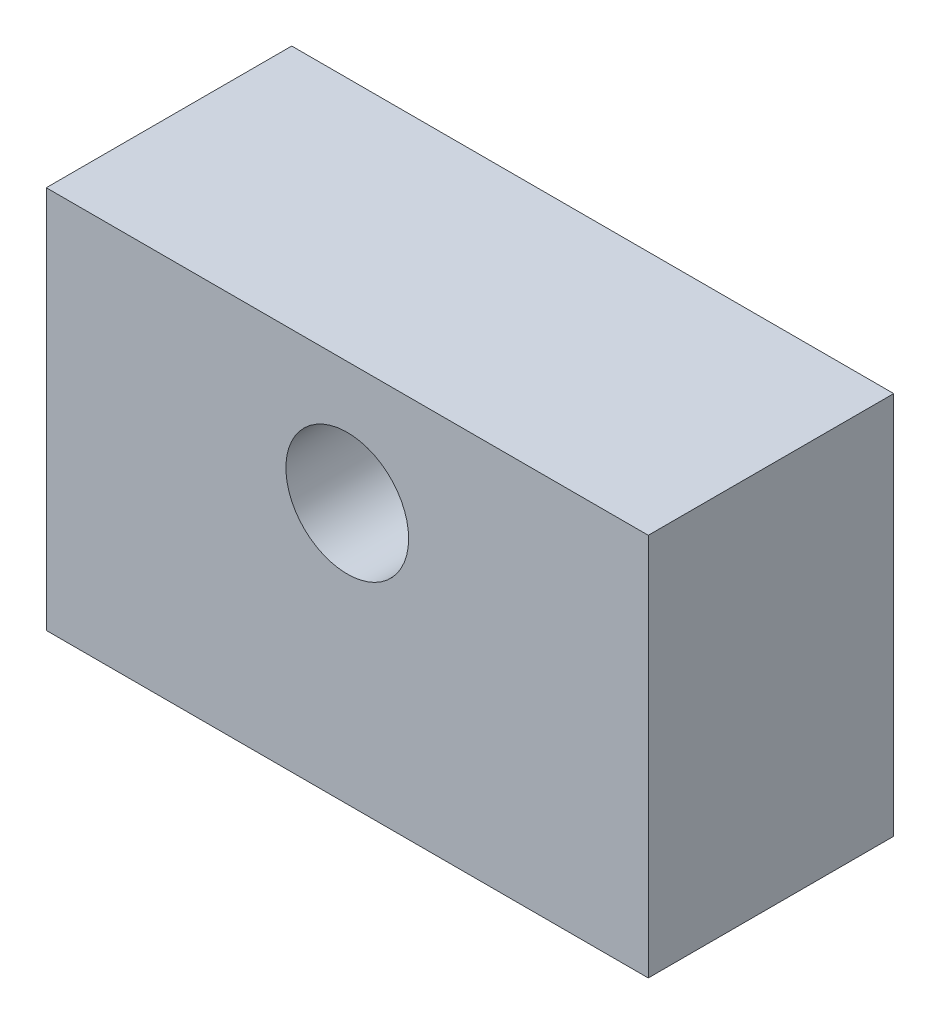
ISO-10303-21;
HEADER;
FILE_DESCRIPTION(('STEP AP214'),'2;1');
FILE_NAME('part.step','',(''),(''),'','','');
FILE_SCHEMA(('AUTOMOTIVE_DESIGN { 1 0 10303 214 1 1 1 1 }'));
ENDSEC;
DATA;
#1=APPLICATION_CONTEXT('core data for automotive mechanical design processes');
#2=APPLICATION_PROTOCOL_DEFINITION('international standard','automotive_design',2000,#1);
#3=PRODUCT_CONTEXT('',#1,'mechanical');
#4=PRODUCT('Part','Part','',(#3));
#5=PRODUCT_RELATED_PRODUCT_CATEGORY('part','',(#4));
#6=PRODUCT_DEFINITION_FORMATION('','',#4);
#7=PRODUCT_DEFINITION_CONTEXT('part definition',#1,'design');
#8=PRODUCT_DEFINITION('design','',#6,#7);
#9=PRODUCT_DEFINITION_SHAPE('','',#8);
#10=(LENGTH_UNIT() NAMED_UNIT(*) SI_UNIT(.MILLI.,.METRE.));
#11=(NAMED_UNIT(*) PLANE_ANGLE_UNIT() SI_UNIT($,.RADIAN.));
#12=(NAMED_UNIT(*) SI_UNIT($,.STERADIAN.) SOLID_ANGLE_UNIT());
#13=UNCERTAINTY_MEASURE_WITH_UNIT(LENGTH_MEASURE(1.E-05),#10,'distance_accuracy_value','');
#14=(GEOMETRIC_REPRESENTATION_CONTEXT(3) GLOBAL_UNCERTAINTY_ASSIGNED_CONTEXT((#13)) GLOBAL_UNIT_ASSIGNED_CONTEXT((#10,
#11,#12)) REPRESENTATION_CONTEXT('',''));
#15=CARTESIAN_POINT('',(0.,0.,0.));
#16=DIRECTION('',(0.,0.,1.));
#17=DIRECTION('',(1.,0.,0.));
#18=AXIS2_PLACEMENT_3D('',#15,#16,#17);
#19=CARTESIAN_POINT('',(0.,-19.8376419710467,6.35));
#20=DIRECTION('',(0.,1.,0.));
#21=DIRECTION('',(-1.,0.,0.));
#22=AXIS2_PLACEMENT_3D('',#19,#20,#21);
#23=PLANE('',#22);
#24=CARTESIAN_POINT('',(23.3612811681514,-19.8376419710467,0.));
#25=DIRECTION('',(0.,1.,0.));
#26=DIRECTION('',(-1.,0.,0.));
#27=AXIS2_PLACEMENT_3D('',#24,#25,#26);
#28=ELLIPSE('',#27,3.66617420935412,3.175);
#29=CARTESIAN_POINT('',(19.6951069587973,-19.8376419710467,0.));
#30=VERTEX_POINT('',#29);
#31=EDGE_CURVE('E11',#30,#30,#28,.T.);
#32=ORIENTED_EDGE('',*,*,#31,.T.);
#33=EDGE_LOOP('',(#32));
#34=FACE_BOUND('',#33,.T.);
#35=DIRECTION('',(1.,0.,0.));
#36=VECTOR('',#35,1.);
#37=CARTESIAN_POINT('',(0.,-19.8376419710467,-6.35));
#38=LINE('',#37,#36);
#39=CARTESIAN_POINT('',(0.,-19.8376419710467,-6.35));
#40=VERTEX_POINT('',#39);
#41=CARTESIAN_POINT('',(31.1483748908686,-19.8376419710467,-6.35));
#42=VERTEX_POINT('',#41);
#43=EDGE_CURVE('E94',#40,#42,#38,.T.);
#44=ORIENTED_EDGE('',*,*,#43,.T.);
#45=DIRECTION('',(0.,0.,-1.));
#46=VECTOR('',#45,1.);
#47=CARTESIAN_POINT('',(31.1483748908686,-19.8376419710467,6.35));
#48=LINE('',#47,#46);
#49=CARTESIAN_POINT('',(31.1483748908686,-19.8376419710467,6.35));
#50=VERTEX_POINT('',#49);
#51=EDGE_CURVE('E92',#50,#42,#48,.T.);
#52=ORIENTED_EDGE('',*,*,#51,.F.);
#53=DIRECTION('',(1.,0.,0.));
#54=VECTOR('',#53,1.);
#55=CARTESIAN_POINT('',(0.,-19.8376419710467,6.35));
#56=LINE('',#55,#54);
#57=CARTESIAN_POINT('',(0.,-19.8376419710467,6.35));
#58=VERTEX_POINT('',#57);
#59=EDGE_CURVE('E84',#58,#50,#56,.T.);
#60=ORIENTED_EDGE('',*,*,#59,.F.);
#61=DIRECTION('',(0.,0.,-1.));
#62=VECTOR('',#61,1.);
#63=CARTESIAN_POINT('',(0.,-19.8376419710467,6.35));
#64=LINE('',#63,#62);
#65=EDGE_CURVE('E95',#58,#40,#64,.T.);
#66=ORIENTED_EDGE('',*,*,#65,.T.);
#67=EDGE_LOOP('',(#44,#52,#60,#66));
#68=FACE_BOUND('',#67,.T.);
#69=CARTESIAN_POINT('',(7.78709372271712,-19.8376419710467,0.));
#70=DIRECTION('',(0.,1.,0.));
#71=DIRECTION('',(1.,0.,0.));
#72=AXIS2_PLACEMENT_3D('',#69,#70,#71);
#73=ELLIPSE('',#72,3.66617420935413,3.175);
#74=CARTESIAN_POINT('',(11.4532679320712,-19.8376419710467,0.));
#75=VERTEX_POINT('',#74);
#76=EDGE_CURVE('E45',#75,#75,#73,.F.);
#77=ORIENTED_EDGE('',*,*,#76,.F.);
#78=EDGE_LOOP('',(#77));
#79=FACE_BOUND('',#78,.T.);
#80=ADVANCED_FACE('F36',(#34,#68,#79),#23,.F.);
#81=CARTESIAN_POINT('',(0.,0.,6.35));
#82=DIRECTION('',(1.,0.,0.));
#83=DIRECTION('',(0.,1.,0.));
#84=AXIS2_PLACEMENT_3D('',#81,#82,#83);
#85=PLANE('',#84);
#86=CARTESIAN_POINT('',(0.,-6.35,0.));
#87=DIRECTION('',(-1.,0.,0.));
#88=DIRECTION('',(0.,-1.,0.));
#89=AXIS2_PLACEMENT_3D('',#86,#87,#88);
#90=CIRCLE('',#89,3.175);
#91=CARTESIAN_POINT('',(0.,-9.525,0.));
#92=VERTEX_POINT('',#91);
#93=EDGE_CURVE('E182',#92,#92,#90,.T.);
#94=ORIENTED_EDGE('',*,*,#93,.F.);
#95=EDGE_LOOP('',(#94));
#96=FACE_BOUND('',#95,.T.);
#97=DIRECTION('',(0.,-1.,0.));
#98=VECTOR('',#97,1.);
#99=CARTESIAN_POINT('',(0.,0.,-6.35));
#100=LINE('',#99,#98);
#101=CARTESIAN_POINT('',(0.,0.,-6.35));
#102=VERTEX_POINT('',#101);
#103=EDGE_CURVE('E104',#102,#40,#100,.T.);
#104=ORIENTED_EDGE('',*,*,#103,.T.);
#105=ORIENTED_EDGE('',*,*,#65,.F.);
#106=DIRECTION('',(0.,-1.,0.));
#107=VECTOR('',#106,1.);
#108=CARTESIAN_POINT('',(0.,0.,6.35));
#109=LINE('',#108,#107);
#110=CARTESIAN_POINT('',(0.,0.,6.35));
#111=VERTEX_POINT('',#110);
#112=EDGE_CURVE('E89',#111,#58,#109,.T.);
#113=ORIENTED_EDGE('',*,*,#112,.F.);
#114=DIRECTION('',(0.,0.,-1.));
#115=VECTOR('',#114,1.);
#116=CARTESIAN_POINT('',(0.,0.,6.35));
#117=LINE('',#116,#115);
#118=EDGE_CURVE('E100',#111,#102,#117,.T.);
#119=ORIENTED_EDGE('',*,*,#118,.T.);
#120=EDGE_LOOP('',(#104,#105,#113,#119));
#121=FACE_BOUND('',#120,.T.);
#122=ADVANCED_FACE('F38',(#96,#121),#85,.F.);
#123=CARTESIAN_POINT('',(31.1483748908686,0.,6.35));
#124=DIRECTION('',(-1.,0.,0.));
#125=DIRECTION('',(0.,-1.,0.));
#126=AXIS2_PLACEMENT_3D('',#123,#124,#125);
#127=PLANE('',#126);
#128=DIRECTION('',(0.,1.,0.));
#129=VECTOR('',#128,1.);
#130=CARTESIAN_POINT('',(31.1483748908686,0.,-6.35));
#131=LINE('',#130,#129);
#132=CARTESIAN_POINT('',(31.1483748908686,0.,-6.35));
#133=VERTEX_POINT('',#132);
#134=EDGE_CURVE('E70',#42,#133,#131,.T.);
#135=ORIENTED_EDGE('',*,*,#134,.T.);
#136=DIRECTION('',(0.,0.,-1.));
#137=VECTOR('',#136,1.);
#138=CARTESIAN_POINT('',(31.1483748908686,0.,6.35));
#139=LINE('',#138,#137);
#140=CARTESIAN_POINT('',(31.1483748908686,0.,6.35));
#141=VERTEX_POINT('',#140);
#142=EDGE_CURVE('E96',#141,#133,#139,.T.);
#143=ORIENTED_EDGE('',*,*,#142,.F.);
#144=DIRECTION('',(0.,1.,0.));
#145=VECTOR('',#144,1.);
#146=CARTESIAN_POINT('',(31.1483748908686,0.,6.35));
#147=LINE('',#146,#145);
#148=EDGE_CURVE('E87',#50,#141,#147,.T.);
#149=ORIENTED_EDGE('',*,*,#148,.F.);
#150=ORIENTED_EDGE('',*,*,#51,.T.);
#151=EDGE_LOOP('',(#135,#143,#149,#150));
#152=FACE_BOUND('',#151,.T.);
#153=ADVANCED_FACE('F98',(#152),#127,.F.);
#154=CARTESIAN_POINT('',(0.,0.,6.35));
#155=DIRECTION('',(0.,-1.,0.));
#156=DIRECTION('',(1.,0.,0.));
#157=AXIS2_PLACEMENT_3D('',#154,#155,#156);
#158=PLANE('',#157);
#159=DIRECTION('',(-1.,0.,0.));
#160=VECTOR('',#159,1.);
#161=CARTESIAN_POINT('',(0.,0.,-6.35));
#162=LINE('',#161,#160);
#163=EDGE_CURVE('E76',#133,#102,#162,.T.);
#164=ORIENTED_EDGE('',*,*,#163,.T.);
#165=ORIENTED_EDGE('',*,*,#118,.F.);
#166=DIRECTION('',(-1.,0.,0.));
#167=VECTOR('',#166,1.);
#168=CARTESIAN_POINT('',(0.,0.,6.35));
#169=LINE('',#168,#167);
#170=EDGE_CURVE('E53',#141,#111,#169,.T.);
#171=ORIENTED_EDGE('',*,*,#170,.F.);
#172=ORIENTED_EDGE('',*,*,#142,.T.);
#173=EDGE_LOOP('',(#164,#165,#171,#172));
#174=FACE_BOUND('',#173,.T.);
#175=ADVANCED_FACE('F126',(#174),#158,.F.);
#176=CARTESIAN_POINT('',(0.,0.,6.35));
#177=DIRECTION('',(0.,0.,1.));
#178=DIRECTION('',(1.,0.,0.));
#179=AXIS2_PLACEMENT_3D('',#176,#177,#178);
#180=PLANE('',#179);
#181=CARTESIAN_POINT('',(15.5741874454343,-6.35,6.35));
#182=DIRECTION('',(0.,0.,-1.));
#183=DIRECTION('',(-1.,0.,0.));
#184=AXIS2_PLACEMENT_3D('',#181,#182,#183);
#185=CIRCLE('',#184,3.175);
#186=CARTESIAN_POINT('',(18.7491874454343,-6.35,6.35));
#187=VERTEX_POINT('',#186);
#188=EDGE_CURVE('E171',#187,#187,#185,.T.);
#189=ORIENTED_EDGE('',*,*,#188,.T.);
#190=EDGE_LOOP('',(#189));
#191=FACE_BOUND('',#190,.T.);
#192=ORIENTED_EDGE('',*,*,#112,.T.);
#193=ORIENTED_EDGE('',*,*,#59,.T.);
#194=ORIENTED_EDGE('',*,*,#148,.T.);
#195=ORIENTED_EDGE('',*,*,#170,.T.);
#196=EDGE_LOOP('',(#192,#193,#194,#195));
#197=FACE_BOUND('',#196,.T.);
#198=ADVANCED_FACE('F85',(#191,#197),#180,.T.);
#199=CARTESIAN_POINT('',(0.,0.,-6.35));
#200=DIRECTION('',(0.,0.,1.));
#201=DIRECTION('',(1.,0.,0.));
#202=AXIS2_PLACEMENT_3D('',#199,#200,#201);
#203=PLANE('',#202);
#204=ORIENTED_EDGE('',*,*,#103,.F.);
#205=ORIENTED_EDGE('',*,*,#163,.F.);
#206=ORIENTED_EDGE('',*,*,#134,.F.);
#207=ORIENTED_EDGE('',*,*,#43,.F.);
#208=EDGE_LOOP('',(#204,#205,#206,#207));
#209=FACE_BOUND('',#208,.T.);
#210=ADVANCED_FACE('F129',(#209),#203,.F.);
#211=CARTESIAN_POINT('',(9.525,-6.35,0.));
#212=DIRECTION('',(-1.,0.,0.));
#213=DIRECTION('',(0.,-1.,0.));
#214=AXIS2_PLACEMENT_3D('',#211,#212,#213);
#215=CYLINDRICAL_SURFACE('',#214,3.175);
#216=CARTESIAN_POINT('',(9.525,-6.35,0.));
#217=DIRECTION('',(-1.,0.,0.));
#218=DIRECTION('',(0.,-1.,0.));
#219=AXIS2_PLACEMENT_3D('',#216,#217,#218);
#220=CIRCLE('',#219,3.175);
#221=CARTESIAN_POINT('',(9.525,-9.525,0.));
#222=VERTEX_POINT('',#221);
#223=EDGE_CURVE('E107',#222,#222,#220,.T.);
#224=CARTESIAN_POINT('',(9.525,-9.525,0.));
#225=CARTESIAN_POINT('',(9.42578125,-9.525,0.));
#226=CARTESIAN_POINT('',(9.3265625,-9.525,0.));
#227=CARTESIAN_POINT('',(9.128125,-9.525,0.));
#228=CARTESIAN_POINT('',(9.02890625,-9.525,0.));
#229=CARTESIAN_POINT('',(8.83046875,-9.525,0.));
#230=CARTESIAN_POINT('',(8.73125,-9.525,0.));
#231=CARTESIAN_POINT('',(8.5328125,-9.525,0.));
#232=CARTESIAN_POINT('',(8.43359375,-9.525,0.));
#233=CARTESIAN_POINT('',(8.23515625,-9.525,0.));
#234=CARTESIAN_POINT('',(8.1359375,-9.525,0.));
#235=CARTESIAN_POINT('',(7.9375,-9.525,0.));
#236=CARTESIAN_POINT('',(7.83828125,-9.525,0.));
#237=CARTESIAN_POINT('',(7.63984375,-9.525,0.));
#238=CARTESIAN_POINT('',(7.540625,-9.525,0.));
#239=CARTESIAN_POINT('',(7.3421875,-9.525,0.));
#240=CARTESIAN_POINT('',(7.24296875,-9.525,0.));
#241=CARTESIAN_POINT('',(7.04453125,-9.525,0.));
#242=CARTESIAN_POINT('',(6.9453125,-9.525,0.));
#243=CARTESIAN_POINT('',(6.746875,-9.525,0.));
#244=CARTESIAN_POINT('',(6.64765625,-9.525,0.));
#245=CARTESIAN_POINT('',(6.44921875,-9.525,0.));
#246=CARTESIAN_POINT('',(6.35,-9.525,0.));
#247=CARTESIAN_POINT('',(6.1515625,-9.525,0.));
#248=CARTESIAN_POINT('',(6.05234375,-9.525,0.));
#249=CARTESIAN_POINT('',(5.85390625,-9.525,0.));
#250=CARTESIAN_POINT('',(5.7546875,-9.525,0.));
#251=CARTESIAN_POINT('',(5.55625,-9.525,0.));
#252=CARTESIAN_POINT('',(5.45703125,-9.525,0.));
#253=CARTESIAN_POINT('',(5.25859375,-9.525,0.));
#254=CARTESIAN_POINT('',(5.159375,-9.525,0.));
#255=CARTESIAN_POINT('',(4.9609375,-9.525,0.));
#256=CARTESIAN_POINT('',(4.86171875,-9.525,0.));
#257=CARTESIAN_POINT('',(4.66328125,-9.525,0.));
#258=CARTESIAN_POINT('',(4.5640625,-9.525,0.));
#259=CARTESIAN_POINT('',(4.365625,-9.525,0.));
#260=CARTESIAN_POINT('',(4.26640625,-9.525,0.));
#261=CARTESIAN_POINT('',(4.06796875,-9.525,0.));
#262=CARTESIAN_POINT('',(3.96875,-9.525,0.));
#263=CARTESIAN_POINT('',(3.7703125,-9.525,0.));
#264=CARTESIAN_POINT('',(3.67109375,-9.525,0.));
#265=CARTESIAN_POINT('',(3.47265625,-9.525,0.));
#266=CARTESIAN_POINT('',(3.3734375,-9.525,0.));
#267=CARTESIAN_POINT('',(3.175,-9.525,0.));
#268=CARTESIAN_POINT('',(3.07578125,-9.525,0.));
#269=CARTESIAN_POINT('',(2.87734375,-9.525,0.));
#270=CARTESIAN_POINT('',(2.778125,-9.525,0.));
#271=CARTESIAN_POINT('',(2.5796875,-9.525,0.));
#272=CARTESIAN_POINT('',(2.48046875,-9.525,0.));
#273=CARTESIAN_POINT('',(2.28203125,-9.525,0.));
#274=CARTESIAN_POINT('',(2.1828125,-9.525,0.));
#275=CARTESIAN_POINT('',(1.984375,-9.525,0.));
#276=CARTESIAN_POINT('',(1.88515625,-9.525,0.));
#277=CARTESIAN_POINT('',(1.68671875,-9.525,0.));
#278=CARTESIAN_POINT('',(1.5875,-9.525,0.));
#279=CARTESIAN_POINT('',(1.3890625,-9.525,0.));
#280=CARTESIAN_POINT('',(1.28984375,-9.525,0.));
#281=CARTESIAN_POINT('',(1.09140625,-9.525,0.));
#282=CARTESIAN_POINT('',(0.992187500000001,-9.525,0.));
#283=CARTESIAN_POINT('',(0.793750000000001,-9.525,0.));
#284=CARTESIAN_POINT('',(0.69453125,-9.525,0.));
#285=CARTESIAN_POINT('',(0.49609375,-9.525,0.));
#286=CARTESIAN_POINT('',(0.396875,-9.525,0.));
#287=CARTESIAN_POINT('',(0.1984375,-9.525,0.));
#288=CARTESIAN_POINT('',(0.0992187500000001,-9.525,0.));
#289=CARTESIAN_POINT('',(0.,-9.525,0.));
#290=B_SPLINE_CURVE_WITH_KNOTS('',3,(#224,#225,#226,#227,#228,#229,#230,#231,#232,#233,#234,
#235,#236,#237,#238,#239,#240,#241,#242,#243,#244,#245,#246,#247,#248,#249,#250,#251,#252,#253,
#254,#255,#256,#257,#258,#259,#260,#261,#262,#263,#264,#265,#266,#267,#268,#269,#270,#271,#272,
#273,#274,#275,#276,#277,#278,#279,#280,#281,#282,#283,#284,#285,#286,#287,#288,#289),
.UNSPECIFIED.,.F.,.F.,(4,2,2,2,2,2,2,2,2,2,2,2,2,2,2,2,2,2,2,2,2,2,2,2,2,2,2,2,2,2,2,2,4),(0.,
0.297656249999998,0.595312499999999,0.892968749999999,1.190625,1.48828125,1.7859375,2.08359375,
2.38125,2.67890625,2.9765625,3.27421875,3.571875,3.86953125,4.1671875,4.46484375,4.7625,
5.06015625,5.3578125,5.65546875,5.953125,6.25078125,6.5484375,6.84609375,7.14375,7.44140625,
7.7390625,8.03671875,8.334375,8.63203125,8.9296875,9.22734375,9.525),.UNSPECIFIED.);
#291=EDGE_CURVE('BSEAM132',#222,#92,#290,.T.);
#292=ORIENTED_EDGE('',*,*,#223,.F.);
#293=ORIENTED_EDGE('',*,*,#93,.T.);
#294=ORIENTED_EDGE('',*,*,#291,.T.);
#295=ORIENTED_EDGE('',*,*,#291,.F.);
#296=EDGE_LOOP('',(#292,#294,#293,#295));
#297=FACE_BOUND('',#296,.T.);
#298=ADVANCED_FACE('F132',(#297),#215,.F.);
#299=CARTESIAN_POINT('',(9.525,-6.35,0.));
#300=DIRECTION('',(-1.,0.,0.));
#301=DIRECTION('',(0.,-1.,0.));
#302=AXIS2_PLACEMENT_3D('',#299,#300,#301);
#303=PLANE('',#302);
#304=ORIENTED_EDGE('',*,*,#223,.T.);
#305=EDGE_LOOP('',(#304));
#306=FACE_BOUND('',#305,.T.);
#307=ADVANCED_FACE('F139',(#306),#303,.T.);
#308=CARTESIAN_POINT('',(5.83963727933594,-23.2107354765103,0.));
#309=DIRECTION('',(0.500000000000001,0.866025403784438,0.));
#310=DIRECTION('',(-0.866025403784438,0.500000000000001,0.));
#311=AXIS2_PLACEMENT_3D('',#308,#309,#310);
#312=CYLINDRICAL_SURFACE('',#311,3.175);
#313=CARTESIAN_POINT('',(12.5495937227171,-11.58875,0.));
#314=DIRECTION('',(-0.500000000000001,-0.866025403784438,0.));
#315=DIRECTION('',(0.866025403784438,-0.500000000000001,0.));
#316=AXIS2_PLACEMENT_3D('',#313,#314,#315);
#317=CIRCLE('',#316,3.175);
#318=CARTESIAN_POINT('',(15.2992243797327,-13.17625,0.));
#319=VERTEX_POINT('',#318);
#320=EDGE_CURVE('E178',#319,#319,#317,.T.);
#321=ORIENTED_EDGE('',*,*,#320,.F.);
#322=EDGE_LOOP('',(#321));
#323=FACE_BOUND('',#322,.T.);
#324=ORIENTED_EDGE('',*,*,#76,.T.);
#325=EDGE_LOOP('',(#324));
#326=FACE_BOUND('',#325,.T.);
#327=ADVANCED_FACE('F116',(#323,#326),#312,.F.);
#328=CARTESIAN_POINT('',(12.5495937227171,-11.58875,0.));
#329=DIRECTION('',(-0.500000000000001,-0.866025403784438,0.));
#330=DIRECTION('',(0.866025403784438,-0.500000000000001,0.));
#331=AXIS2_PLACEMENT_3D('',#328,#329,#330);
#332=PLANE('',#331);
#333=ORIENTED_EDGE('',*,*,#320,.T.);
#334=EDGE_LOOP('',(#333));
#335=FACE_BOUND('',#334,.T.);
#336=ADVANCED_FACE('F146',(#335),#332,.T.);
#337=CARTESIAN_POINT('',(15.5741874454343,-6.35,-3.175));
#338=DIRECTION('',(0.,0.,1.));
#339=DIRECTION('',(1.,0.,0.));
#340=AXIS2_PLACEMENT_3D('',#337,#338,#339);
#341=CYLINDRICAL_SURFACE('',#340,3.175);
#342=CARTESIAN_POINT('',(15.5741874454343,-6.35,-3.175));
#343=DIRECTION('',(0.,0.,-1.));
#344=DIRECTION('',(-1.,0.,0.));
#345=AXIS2_PLACEMENT_3D('',#342,#343,#344);
#346=CIRCLE('',#345,3.175);
#347=CARTESIAN_POINT('',(18.7491874454343,-6.35,-3.175));
#348=VERTEX_POINT('',#347);
#349=EDGE_CURVE('E174',#348,#348,#346,.T.);
#350=CARTESIAN_POINT('',(18.7491874454343,-6.35,-3.175));
#351=CARTESIAN_POINT('',(18.7491874454343,-6.35,-3.07578125));
#352=CARTESIAN_POINT('',(18.7491874454343,-6.35,-2.9765625));
#353=CARTESIAN_POINT('',(18.7491874454343,-6.35,-2.778125));
#354=CARTESIAN_POINT('',(18.7491874454343,-6.35,-2.67890625));
#355=CARTESIAN_POINT('',(18.7491874454343,-6.35,-2.48046875));
#356=CARTESIAN_POINT('',(18.7491874454343,-6.35,-2.38125));
#357=CARTESIAN_POINT('',(18.7491874454343,-6.35,-2.1828125));
#358=CARTESIAN_POINT('',(18.7491874454343,-6.35,-2.08359375));
#359=CARTESIAN_POINT('',(18.7491874454343,-6.35,-1.88515625));
#360=CARTESIAN_POINT('',(18.7491874454343,-6.35,-1.7859375));
#361=CARTESIAN_POINT('',(18.7491874454343,-6.35,-1.5875));
#362=CARTESIAN_POINT('',(18.7491874454343,-6.35,-1.48828125));
#363=CARTESIAN_POINT('',(18.7491874454343,-6.35,-1.28984375));
#364=CARTESIAN_POINT('',(18.7491874454343,-6.35,-1.190625));
#365=CARTESIAN_POINT('',(18.7491874454343,-6.35,-0.992187500000001));
#366=CARTESIAN_POINT('',(18.7491874454343,-6.35,-0.892968750000001));
#367=CARTESIAN_POINT('',(18.7491874454343,-6.35,-0.694531250000001));
#368=CARTESIAN_POINT('',(18.7491874454343,-6.35,-0.5953125));
#369=CARTESIAN_POINT('',(18.7491874454343,-6.35,-0.396875));
#370=CARTESIAN_POINT('',(18.7491874454343,-6.35,-0.29765625));
#371=CARTESIAN_POINT('',(18.7491874454343,-6.35,-0.0992187500000004));
#372=CARTESIAN_POINT('',(18.7491874454343,-6.35,0.));
#373=CARTESIAN_POINT('',(18.7491874454343,-6.35,0.1984375));
#374=CARTESIAN_POINT('',(18.7491874454343,-6.35,0.29765625));
#375=CARTESIAN_POINT('',(18.7491874454343,-6.35,0.49609375));
#376=CARTESIAN_POINT('',(18.7491874454343,-6.35,0.5953125));
#377=CARTESIAN_POINT('',(18.7491874454343,-6.35,0.79375));
#378=CARTESIAN_POINT('',(18.7491874454343,-6.35,0.892968749999999));
#379=CARTESIAN_POINT('',(18.7491874454343,-6.35,1.09140625));
#380=CARTESIAN_POINT('',(18.7491874454343,-6.35,1.190625));
#381=CARTESIAN_POINT('',(18.7491874454343,-6.35,1.3890625));
#382=CARTESIAN_POINT('',(18.7491874454343,-6.35,1.48828125));
#383=CARTESIAN_POINT('',(18.7491874454343,-6.35,1.68671875));
#384=CARTESIAN_POINT('',(18.7491874454343,-6.35,1.7859375));
#385=CARTESIAN_POINT('',(18.7491874454343,-6.35,1.984375));
#386=CARTESIAN_POINT('',(18.7491874454343,-6.35,2.08359375));
#387=CARTESIAN_POINT('',(18.7491874454343,-6.35,2.28203125));
#388=CARTESIAN_POINT('',(18.7491874454343,-6.35,2.38125));
#389=CARTESIAN_POINT('',(18.7491874454343,-6.35,2.5796875));
#390=CARTESIAN_POINT('',(18.7491874454343,-6.35,2.67890625));
#391=CARTESIAN_POINT('',(18.7491874454343,-6.35,2.87734375));
#392=CARTESIAN_POINT('',(18.7491874454343,-6.35,2.9765625));
#393=CARTESIAN_POINT('',(18.7491874454343,-6.35,3.175));
#394=CARTESIAN_POINT('',(18.7491874454343,-6.35,3.27421875));
#395=CARTESIAN_POINT('',(18.7491874454343,-6.35,3.47265625));
#396=CARTESIAN_POINT('',(18.7491874454343,-6.35,3.571875));
#397=CARTESIAN_POINT('',(18.7491874454343,-6.35,3.7703125));
#398=CARTESIAN_POINT('',(18.7491874454343,-6.35,3.86953125));
#399=CARTESIAN_POINT('',(18.7491874454343,-6.35,4.06796875));
#400=CARTESIAN_POINT('',(18.7491874454343,-6.35,4.1671875));
#401=CARTESIAN_POINT('',(18.7491874454343,-6.35,4.365625));
#402=CARTESIAN_POINT('',(18.7491874454343,-6.35,4.46484375));
#403=CARTESIAN_POINT('',(18.7491874454343,-6.35,4.66328125));
#404=CARTESIAN_POINT('',(18.7491874454343,-6.35,4.7625));
#405=CARTESIAN_POINT('',(18.7491874454343,-6.35,4.9609375));
#406=CARTESIAN_POINT('',(18.7491874454343,-6.35,5.06015625));
#407=CARTESIAN_POINT('',(18.7491874454343,-6.35,5.25859375));
#408=CARTESIAN_POINT('',(18.7491874454343,-6.35,5.3578125));
#409=CARTESIAN_POINT('',(18.7491874454343,-6.35,5.55625));
#410=CARTESIAN_POINT('',(18.7491874454343,-6.35,5.65546875));
#411=CARTESIAN_POINT('',(18.7491874454343,-6.35,5.85390625));
#412=CARTESIAN_POINT('',(18.7491874454343,-6.35,5.953125));
#413=CARTESIAN_POINT('',(18.7491874454343,-6.35,6.1515625));
#414=CARTESIAN_POINT('',(18.7491874454343,-6.35,6.25078125));
#415=CARTESIAN_POINT('',(18.7491874454343,-6.35,6.35));
#416=B_SPLINE_CURVE_WITH_KNOTS('',3,(#350,#351,#352,#353,#354,#355,#356,#357,#358,#359,#360,
#361,#362,#363,#364,#365,#366,#367,#368,#369,#370,#371,#372,#373,#374,#375,#376,#377,#378,#379,
#380,#381,#382,#383,#384,#385,#386,#387,#388,#389,#390,#391,#392,#393,#394,#395,#396,#397,#398,
#399,#400,#401,#402,#403,#404,#405,#406,#407,#408,#409,#410,#411,#412,#413,#414,#415),
.UNSPECIFIED.,.F.,.F.,(4,2,2,2,2,2,2,2,2,2,2,2,2,2,2,2,2,2,2,2,2,2,2,2,2,2,2,2,2,2,2,2,4),(0.,
0.29765625,0.5953125,0.892968750000001,1.190625,1.48828125,1.7859375,2.08359375,2.38125,
2.67890625,2.9765625,3.27421875,3.571875,3.86953125,4.1671875,4.46484375,4.7625,5.06015625,
5.3578125,5.65546875,5.953125,6.25078125,6.5484375,6.84609375,7.14375,7.44140625,7.7390625,
8.03671875,8.334375,8.63203125,8.9296875,9.22734375,9.525),.UNSPECIFIED.);
#417=EDGE_CURVE('BSEAM150',#348,#187,#416,.T.);
#418=ORIENTED_EDGE('',*,*,#349,.T.);
#419=ORIENTED_EDGE('',*,*,#188,.F.);
#420=ORIENTED_EDGE('',*,*,#417,.T.);
#421=ORIENTED_EDGE('',*,*,#417,.F.);
#422=EDGE_LOOP('',(#418,#420,#419,#421));
#423=FACE_BOUND('',#422,.T.);
#424=ADVANCED_FACE('F150',(#423),#341,.F.);
#425=CARTESIAN_POINT('',(15.5741874454343,-6.35,-3.175));
#426=DIRECTION('',(0.,0.,-1.));
#427=DIRECTION('',(-1.,0.,0.));
#428=AXIS2_PLACEMENT_3D('',#425,#426,#427);
#429=PLANE('',#428);
#430=ORIENTED_EDGE('',*,*,#349,.F.);
#431=EDGE_LOOP('',(#430));
#432=FACE_BOUND('',#431,.T.);
#433=ADVANCED_FACE('F154',(#432),#429,.F.);
#434=CARTESIAN_POINT('',(25.3087376115326,-23.2107354765103,0.));
#435=DIRECTION('',(-0.500000000000001,0.866025403784438,0.));
#436=DIRECTION('',(-0.866025403784438,-0.500000000000001,0.));
#437=AXIS2_PLACEMENT_3D('',#434,#435,#436);
#438=CYLINDRICAL_SURFACE('',#437,3.175);
#439=CARTESIAN_POINT('',(18.5987811681514,-11.58875,0.));
#440=DIRECTION('',(-0.500000000000001,0.866025403784438,0.));
#441=DIRECTION('',(-0.866025403784438,-0.500000000000001,0.));
#442=AXIS2_PLACEMENT_3D('',#439,#440,#441);
#443=CIRCLE('',#442,3.175);
#444=CARTESIAN_POINT('',(15.8491505111358,-13.17625,0.));
#445=VERTEX_POINT('',#444);
#446=EDGE_CURVE('E170',#445,#445,#443,.T.);
#447=ORIENTED_EDGE('',*,*,#446,.T.);
#448=EDGE_LOOP('',(#447));
#449=FACE_BOUND('',#448,.T.);
#450=ORIENTED_EDGE('',*,*,#31,.F.);
#451=EDGE_LOOP('',(#450));
#452=FACE_BOUND('',#451,.T.);
#453=ADVANCED_FACE('F158',(#449,#452),#438,.F.);
#454=CARTESIAN_POINT('',(18.5987811681514,-11.58875,0.));
#455=DIRECTION('',(0.500000000000001,-0.866025403784438,0.));
#456=DIRECTION('',(-0.866025403784438,-0.500000000000001,0.));
#457=AXIS2_PLACEMENT_3D('',#454,#455,#456);
#458=PLANE('',#457);
#459=ORIENTED_EDGE('',*,*,#446,.F.);
#460=EDGE_LOOP('',(#459));
#461=FACE_BOUND('',#460,.T.);
#462=ADVANCED_FACE('F162',(#461),#458,.T.);
#463=CLOSED_SHELL('',(#80,#122,#153,#175,#198,#210,#298,#307,#327,#336,#424,#433,#453,#462));
#464=MANIFOLD_SOLID_BREP('B2',#463);
#465=ADVANCED_BREP_SHAPE_REPRESENTATION('',(#18,#464),#14);
#466=SHAPE_DEFINITION_REPRESENTATION(#9,#465);
ENDSEC;
END-ISO-10303-21;
